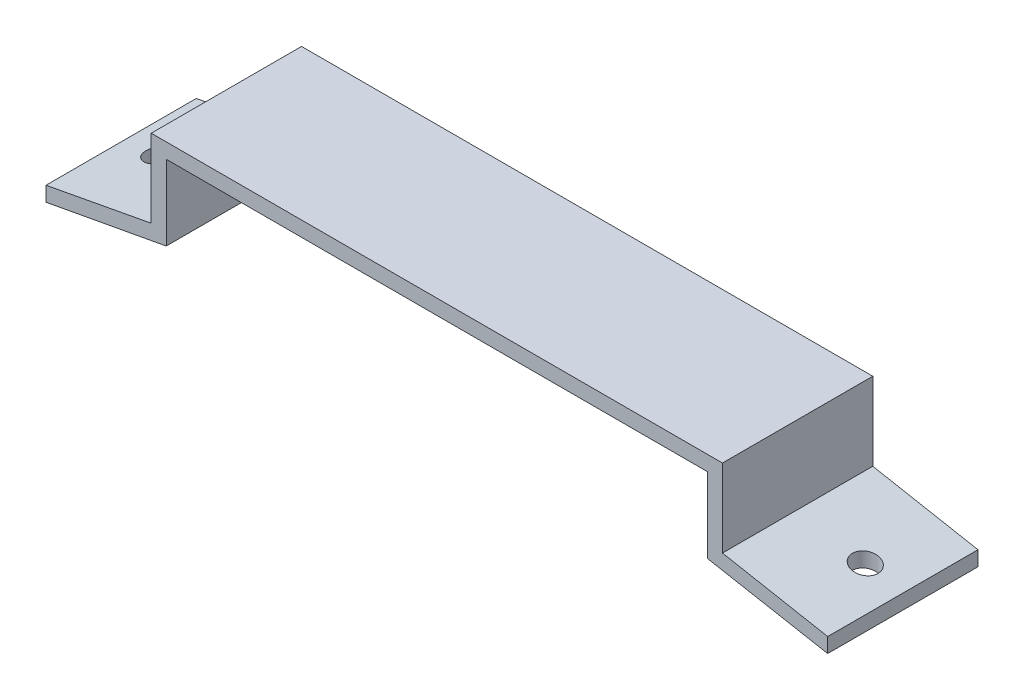
ISO-10303-21;
HEADER;
FILE_DESCRIPTION(('STEP AP214'),'2;1');
FILE_NAME('part.step','',(''),(''),'','','');
FILE_SCHEMA(('AUTOMOTIVE_DESIGN { 1 0 10303 214 1 1 1 1 }'));
ENDSEC;
DATA;
#1=APPLICATION_CONTEXT('core data for automotive mechanical design processes');
#2=APPLICATION_PROTOCOL_DEFINITION('international standard','automotive_design',2000,#1);
#3=PRODUCT_CONTEXT('',#1,'mechanical');
#4=PRODUCT('Part','Part','',(#3));
#5=PRODUCT_RELATED_PRODUCT_CATEGORY('part','',(#4));
#6=PRODUCT_DEFINITION_FORMATION('','',#4);
#7=PRODUCT_DEFINITION_CONTEXT('part definition',#1,'design');
#8=PRODUCT_DEFINITION('design','',#6,#7);
#9=PRODUCT_DEFINITION_SHAPE('','',#8);
#10=(LENGTH_UNIT() NAMED_UNIT(*) SI_UNIT(.MILLI.,.METRE.));
#11=(NAMED_UNIT(*) PLANE_ANGLE_UNIT() SI_UNIT($,.RADIAN.));
#12=(NAMED_UNIT(*) SI_UNIT($,.STERADIAN.) SOLID_ANGLE_UNIT());
#13=UNCERTAINTY_MEASURE_WITH_UNIT(LENGTH_MEASURE(1.E-05),#10,'distance_accuracy_value','');
#14=(GEOMETRIC_REPRESENTATION_CONTEXT(3) GLOBAL_UNCERTAINTY_ASSIGNED_CONTEXT((#13)) GLOBAL_UNIT_ASSIGNED_CONTEXT((#10,
#11,#12)) REPRESENTATION_CONTEXT('',''));
#15=CARTESIAN_POINT('',(0.,0.,0.));
#16=DIRECTION('',(0.,0.,1.));
#17=DIRECTION('',(1.,0.,0.));
#18=AXIS2_PLACEMENT_3D('',#15,#16,#17);
#19=CARTESIAN_POINT('',(0.,0.,10.));
#20=DIRECTION('',(0.,0.,1.));
#21=DIRECTION('',(1.,0.,0.));
#22=AXIS2_PLACEMENT_3D('',#19,#20,#21);
#23=PLANE('',#22);
#24=DIRECTION('',(0.983332166035633,0.181818181818182,0.));
#25=VECTOR('',#24,1.);
#26=CARTESIAN_POINT('',(-36.,0.,10.));
#27=LINE('',#26,#25);
#28=CARTESIAN_POINT('',(-52.,-2.95840104653455,10.));
#29=VERTEX_POINT('',#28);
#30=CARTESIAN_POINT('',(-36.,0.,10.));
#31=VERTEX_POINT('',#30);
#32=EDGE_CURVE('E214',#29,#31,#27,.T.);
#33=ORIENTED_EDGE('',*,*,#32,.T.);
#34=DIRECTION('',(0.,-1.,0.));
#35=VECTOR('',#34,1.);
#36=CARTESIAN_POINT('',(-36.,10.,10.));
#37=LINE('',#36,#35);
#38=CARTESIAN_POINT('',(-36.,10.,10.));
#39=VERTEX_POINT('',#38);
#40=EDGE_CURVE('E192',#39,#31,#37,.T.);
#41=ORIENTED_EDGE('',*,*,#40,.F.);
#42=DIRECTION('',(1.,0.,0.));
#43=VECTOR('',#42,1.);
#44=CARTESIAN_POINT('',(0.,10.,10.));
#45=LINE('',#44,#43);
#46=CARTESIAN_POINT('',(36.,10.,10.));
#47=VERTEX_POINT('',#46);
#48=EDGE_CURVE('E190',#39,#47,#45,.T.);
#49=ORIENTED_EDGE('',*,*,#48,.T.);
#50=DIRECTION('',(0.,-1.,0.));
#51=VECTOR('',#50,1.);
#52=CARTESIAN_POINT('',(36.,10.,10.));
#53=LINE('',#52,#51);
#54=CARTESIAN_POINT('',(36.,0.,10.));
#55=VERTEX_POINT('',#54);
#56=EDGE_CURVE('E141',#47,#55,#53,.T.);
#57=ORIENTED_EDGE('',*,*,#56,.T.);
#58=DIRECTION('',(-0.983332166035633,0.181818181818182,0.));
#59=VECTOR('',#58,1.);
#60=CARTESIAN_POINT('',(36.,0.,10.));
#61=LINE('',#60,#59);
#62=CARTESIAN_POINT('',(52.,-2.95840104653455,10.));
#63=VERTEX_POINT('',#62);
#64=EDGE_CURVE('E170',#63,#55,#61,.T.);
#65=ORIENTED_EDGE('',*,*,#64,.F.);
#66=DIRECTION('',(0.,-1.,0.));
#67=VECTOR('',#66,1.);
#68=CARTESIAN_POINT('',(52.,-0.992722896260925,10.));
#69=LINE('',#68,#67);
#70=CARTESIAN_POINT('',(52.,-0.992722896260925,10.));
#71=VERTEX_POINT('',#70);
#72=EDGE_CURVE('E167',#71,#63,#69,.T.);
#73=ORIENTED_EDGE('',*,*,#72,.F.);
#74=DIRECTION('',(0.982953069989005,-0.183856634906629,0.));
#75=VECTOR('',#74,1.);
#76=CARTESIAN_POINT('',(36.,2.,10.));
#77=LINE('',#76,#75);
#78=CARTESIAN_POINT('',(38.,1.62590963796738,10.));
#79=VERTEX_POINT('',#78);
#80=EDGE_CURVE('E164',#79,#71,#77,.T.);
#81=ORIENTED_EDGE('',*,*,#80,.F.);
#82=DIRECTION('',(0.,-1.,0.));
#83=VECTOR('',#82,1.);
#84=CARTESIAN_POINT('',(38.,12.,10.));
#85=LINE('',#84,#83);
#86=CARTESIAN_POINT('',(38.,12.,10.));
#87=VERTEX_POINT('',#86);
#88=EDGE_CURVE('E152',#87,#79,#85,.T.);
#89=ORIENTED_EDGE('',*,*,#88,.F.);
#90=DIRECTION('',(1.,0.,0.));
#91=VECTOR('',#90,1.);
#92=CARTESIAN_POINT('',(0.,12.,10.));
#93=LINE('',#92,#91);
#94=CARTESIAN_POINT('',(-38.,12.,10.));
#95=VERTEX_POINT('',#94);
#96=EDGE_CURVE('E200',#95,#87,#93,.T.);
#97=ORIENTED_EDGE('',*,*,#96,.F.);
#98=DIRECTION('',(0.,-1.,0.));
#99=VECTOR('',#98,1.);
#100=CARTESIAN_POINT('',(-38.,12.,10.));
#101=LINE('',#100,#99);
#102=CARTESIAN_POINT('',(-38.,1.62590963796738,10.));
#103=VERTEX_POINT('',#102);
#104=EDGE_CURVE('E202',#95,#103,#101,.T.);
#105=ORIENTED_EDGE('',*,*,#104,.T.);
#106=DIRECTION('',(-0.982953069989005,-0.183856634906629,0.));
#107=VECTOR('',#106,1.);
#108=CARTESIAN_POINT('',(-36.,2.,10.));
#109=LINE('',#108,#107);
#110=CARTESIAN_POINT('',(-52.,-0.992722896260925,10.));
#111=VERTEX_POINT('',#110);
#112=EDGE_CURVE('E51',#103,#111,#109,.T.);
#113=ORIENTED_EDGE('',*,*,#112,.T.);
#114=DIRECTION('',(0.,-1.,0.));
#115=VECTOR('',#114,1.);
#116=CARTESIAN_POINT('',(-52.,-0.992722896260925,10.));
#117=LINE('',#116,#115);
#118=EDGE_CURVE('E211',#111,#29,#117,.T.);
#119=ORIENTED_EDGE('',*,*,#118,.T.);
#120=EDGE_LOOP('',(#33,#41,#49,#57,#65,#73,#81,#89,#97,#105,#113,#119));
#121=FACE_BOUND('',#120,.T.);
#122=ADVANCED_FACE('F35',(#121),#23,.T.);
#123=CARTESIAN_POINT('',(0.,0.,-10.));
#124=DIRECTION('',(0.,0.,1.));
#125=DIRECTION('',(1.,0.,0.));
#126=AXIS2_PLACEMENT_3D('',#123,#124,#125);
#127=PLANE('',#126);
#128=DIRECTION('',(0.,-1.,0.));
#129=VECTOR('',#128,1.);
#130=CARTESIAN_POINT('',(-36.,10.,-10.));
#131=LINE('',#130,#129);
#132=CARTESIAN_POINT('',(-36.,10.,-10.));
#133=VERTEX_POINT('',#132);
#134=CARTESIAN_POINT('',(-36.,0.,-10.));
#135=VERTEX_POINT('',#134);
#136=EDGE_CURVE('E194',#133,#135,#131,.T.);
#137=ORIENTED_EDGE('',*,*,#136,.T.);
#138=DIRECTION('',(0.983332166035633,0.181818181818182,0.));
#139=VECTOR('',#138,1.);
#140=CARTESIAN_POINT('',(-36.,0.,-10.));
#141=LINE('',#140,#139);
#142=CARTESIAN_POINT('',(-52.,-2.95840104653455,-10.));
#143=VERTEX_POINT('',#142);
#144=EDGE_CURVE('E212',#143,#135,#141,.T.);
#145=ORIENTED_EDGE('',*,*,#144,.F.);
#146=DIRECTION('',(0.,-1.,0.));
#147=VECTOR('',#146,1.);
#148=CARTESIAN_POINT('',(-52.,-0.992722896260925,-10.));
#149=LINE('',#148,#147);
#150=CARTESIAN_POINT('',(-52.,-0.992722896260925,-10.));
#151=VERTEX_POINT('',#150);
#152=EDGE_CURVE('E219',#151,#143,#149,.T.);
#153=ORIENTED_EDGE('',*,*,#152,.F.);
#154=DIRECTION('',(-0.982953069989005,-0.183856634906629,0.));
#155=VECTOR('',#154,1.);
#156=CARTESIAN_POINT('',(-36.,2.,-10.));
#157=LINE('',#156,#155);
#158=CARTESIAN_POINT('',(-38.,1.62590963796738,-10.));
#159=VERTEX_POINT('',#158);
#160=EDGE_CURVE('E209',#159,#151,#157,.T.);
#161=ORIENTED_EDGE('',*,*,#160,.F.);
#162=DIRECTION('',(0.,-1.,0.));
#163=VECTOR('',#162,1.);
#164=CARTESIAN_POINT('',(-38.,12.,-10.));
#165=LINE('',#164,#163);
#166=CARTESIAN_POINT('',(-38.,12.,-10.));
#167=VERTEX_POINT('',#166);
#168=EDGE_CURVE('E205',#167,#159,#165,.T.);
#169=ORIENTED_EDGE('',*,*,#168,.F.);
#170=DIRECTION('',(1.,0.,0.));
#171=VECTOR('',#170,1.);
#172=CARTESIAN_POINT('',(0.,12.,-10.));
#173=LINE('',#172,#171);
#174=CARTESIAN_POINT('',(38.,12.,-10.));
#175=VERTEX_POINT('',#174);
#176=EDGE_CURVE('E196',#167,#175,#173,.T.);
#177=ORIENTED_EDGE('',*,*,#176,.T.);
#178=DIRECTION('',(0.,-1.,0.));
#179=VECTOR('',#178,1.);
#180=CARTESIAN_POINT('',(38.,12.,-10.));
#181=LINE('',#180,#179);
#182=CARTESIAN_POINT('',(38.,1.62590963796738,-10.));
#183=VERTEX_POINT('',#182);
#184=EDGE_CURVE('E158',#175,#183,#181,.T.);
#185=ORIENTED_EDGE('',*,*,#184,.T.);
#186=DIRECTION('',(0.982953069989005,-0.183856634906629,0.));
#187=VECTOR('',#186,1.);
#188=CARTESIAN_POINT('',(36.,2.,-10.));
#189=LINE('',#188,#187);
#190=CARTESIAN_POINT('',(52.,-0.992722896260925,-10.));
#191=VERTEX_POINT('',#190);
#192=EDGE_CURVE('E163',#183,#191,#189,.T.);
#193=ORIENTED_EDGE('',*,*,#192,.T.);
#194=DIRECTION('',(0.,-1.,0.));
#195=VECTOR('',#194,1.);
#196=CARTESIAN_POINT('',(52.,-0.992722896260925,-10.));
#197=LINE('',#196,#195);
#198=CARTESIAN_POINT('',(52.,-2.95840104653455,-10.));
#199=VERTEX_POINT('',#198);
#200=EDGE_CURVE('E176',#191,#199,#197,.T.);
#201=ORIENTED_EDGE('',*,*,#200,.T.);
#202=DIRECTION('',(-0.983332166035633,0.181818181818182,0.));
#203=VECTOR('',#202,1.);
#204=CARTESIAN_POINT('',(36.,0.,-10.));
#205=LINE('',#204,#203);
#206=CARTESIAN_POINT('',(36.,0.,-10.));
#207=VERTEX_POINT('',#206);
#208=EDGE_CURVE('E148',#199,#207,#205,.T.);
#209=ORIENTED_EDGE('',*,*,#208,.T.);
#210=DIRECTION('',(0.,-1.,0.));
#211=VECTOR('',#210,1.);
#212=CARTESIAN_POINT('',(36.,10.,-10.));
#213=LINE('',#212,#211);
#214=CARTESIAN_POINT('',(36.,10.,-10.));
#215=VERTEX_POINT('',#214);
#216=EDGE_CURVE('E139',#215,#207,#213,.T.);
#217=ORIENTED_EDGE('',*,*,#216,.F.);
#218=DIRECTION('',(1.,0.,0.));
#219=VECTOR('',#218,1.);
#220=CARTESIAN_POINT('',(0.,10.,-10.));
#221=LINE('',#220,#219);
#222=EDGE_CURVE('E124',#133,#215,#221,.T.);
#223=ORIENTED_EDGE('',*,*,#222,.F.);
#224=EDGE_LOOP('',(#137,#145,#153,#161,#169,#177,#185,#193,#201,#209,#217,#223));
#225=FACE_BOUND('',#224,.T.);
#226=ADVANCED_FACE('F145',(#225),#127,.F.);
#227=CARTESIAN_POINT('',(-36.,2.,10.));
#228=DIRECTION('',(0.183856634906629,-0.982953069989005,0.));
#229=DIRECTION('',(0.982953069989006,0.183856634906629,0.));
#230=AXIS2_PLACEMENT_3D('',#227,#228,#229);
#231=PLANE('',#230);
#232=CARTESIAN_POINT('',(-47.,-0.057496991179387,0.));
#233=DIRECTION('',(0.183856634906629,-0.982953069989005,0.));
#234=DIRECTION('',(0.982953069989006,0.183856634906629,0.));
#235=AXIS2_PLACEMENT_3D('',#232,#233,#234);
#236=ELLIPSE('',#235,1.72948236482848,1.7);
#237=CARTESIAN_POINT('',(-45.3,0.260479816548336,0.));
#238=VERTEX_POINT('',#237);
#239=EDGE_CURVE('E134',#238,#238,#236,.T.);
#240=ORIENTED_EDGE('',*,*,#239,.T.);
#241=EDGE_LOOP('',(#240));
#242=FACE_BOUND('',#241,.T.);
#243=DIRECTION('',(0.,0.,1.));
#244=VECTOR('',#243,1.);
#245=CARTESIAN_POINT('',(-38.,1.62590963796738,10.));
#246=LINE('',#245,#244);
#247=EDGE_CURVE('E55',#159,#103,#246,.T.);
#248=ORIENTED_EDGE('',*,*,#247,.F.);
#249=ORIENTED_EDGE('',*,*,#160,.T.);
#250=DIRECTION('',(0.,0.,-1.));
#251=VECTOR('',#250,1.);
#252=CARTESIAN_POINT('',(-52.,-0.992722896260925,10.));
#253=LINE('',#252,#251);
#254=EDGE_CURVE('E11',#111,#151,#253,.T.);
#255=ORIENTED_EDGE('',*,*,#254,.F.);
#256=ORIENTED_EDGE('',*,*,#112,.F.);
#257=EDGE_LOOP('',(#248,#249,#255,#256));
#258=FACE_BOUND('',#257,.T.);
#259=ADVANCED_FACE('F37',(#242,#258),#231,.F.);
#260=CARTESIAN_POINT('',(-52.,-0.992722896260925,10.));
#261=DIRECTION('',(1.,0.,0.));
#262=DIRECTION('',(0.,0.,-1.));
#263=AXIS2_PLACEMENT_3D('',#260,#261,#262);
#264=PLANE('',#263);
#265=ORIENTED_EDGE('',*,*,#152,.T.);
#266=DIRECTION('',(0.,0.,-1.));
#267=VECTOR('',#266,1.);
#268=CARTESIAN_POINT('',(-52.,-2.95840104653455,10.));
#269=LINE('',#268,#267);
#270=EDGE_CURVE('E44',#29,#143,#269,.T.);
#271=ORIENTED_EDGE('',*,*,#270,.F.);
#272=ORIENTED_EDGE('',*,*,#118,.F.);
#273=ORIENTED_EDGE('',*,*,#254,.T.);
#274=EDGE_LOOP('',(#265,#271,#272,#273));
#275=FACE_BOUND('',#274,.T.);
#276=ADVANCED_FACE('F238',(#275),#264,.F.);
#277=CARTESIAN_POINT('',(-36.,0.,10.));
#278=DIRECTION('',(-0.181818181818182,0.983332166035633,0.));
#279=DIRECTION('',(-0.983332166035634,-0.181818181818182,0.));
#280=AXIS2_PLACEMENT_3D('',#277,#278,#279);
#281=PLANE('',#280);
#282=CARTESIAN_POINT('',(-47.,-2.03390071949251,0.));
#283=DIRECTION('',(-0.181818181818182,0.983332166035633,0.));
#284=DIRECTION('',(0.983332166035634,0.181818181818182,0.));
#285=AXIS2_PLACEMENT_3D('',#282,#283,#284);
#286=ELLIPSE('',#285,1.72881561156863,1.7);
#287=CARTESIAN_POINT('',(-45.3,-1.71957060829821,0.));
#288=VERTEX_POINT('',#287);
#289=EDGE_CURVE('E39',#288,#288,#286,.T.);
#290=ORIENTED_EDGE('',*,*,#289,.T.);
#291=EDGE_LOOP('',(#290));
#292=FACE_BOUND('',#291,.T.);
#293=ORIENTED_EDGE('',*,*,#144,.T.);
#294=DIRECTION('',(0.,0.,-1.));
#295=VECTOR('',#294,1.);
#296=CARTESIAN_POINT('',(-36.,0.,10.));
#297=LINE('',#296,#295);
#298=EDGE_CURVE('E217',#31,#135,#297,.T.);
#299=ORIENTED_EDGE('',*,*,#298,.F.);
#300=ORIENTED_EDGE('',*,*,#32,.F.);
#301=ORIENTED_EDGE('',*,*,#270,.T.);
#302=EDGE_LOOP('',(#293,#299,#300,#301));
#303=FACE_BOUND('',#302,.T.);
#304=ADVANCED_FACE('F229',(#292,#303),#281,.F.);
#305=CARTESIAN_POINT('',(-38.,12.,0.));
#306=DIRECTION('',(1.,0.,0.));
#307=DIRECTION('',(0.,0.,-1.));
#308=AXIS2_PLACEMENT_3D('',#305,#306,#307);
#309=PLANE('',#308);
#310=ORIENTED_EDGE('',*,*,#168,.T.);
#311=ORIENTED_EDGE('',*,*,#247,.T.);
#312=ORIENTED_EDGE('',*,*,#104,.F.);
#313=DIRECTION('',(0.,0.,1.));
#314=VECTOR('',#313,1.);
#315=CARTESIAN_POINT('',(-38.,12.,0.));
#316=LINE('',#315,#314);
#317=EDGE_CURVE('E198',#167,#95,#316,.T.);
#318=ORIENTED_EDGE('',*,*,#317,.F.);
#319=EDGE_LOOP('',(#310,#311,#312,#318));
#320=FACE_BOUND('',#319,.T.);
#321=ADVANCED_FACE('F241',(#320),#309,.F.);
#322=CARTESIAN_POINT('',(0.,12.,0.));
#323=DIRECTION('',(0.,1.,0.));
#324=DIRECTION('',(0.,0.,1.));
#325=AXIS2_PLACEMENT_3D('',#322,#323,#324);
#326=PLANE('',#325);
#327=ORIENTED_EDGE('',*,*,#176,.F.);
#328=ORIENTED_EDGE('',*,*,#317,.T.);
#329=ORIENTED_EDGE('',*,*,#96,.T.);
#330=DIRECTION('',(0.,0.,1.));
#331=VECTOR('',#330,1.);
#332=CARTESIAN_POINT('',(38.,12.,0.));
#333=LINE('',#332,#331);
#334=EDGE_CURVE('E149',#175,#87,#333,.T.);
#335=ORIENTED_EDGE('',*,*,#334,.F.);
#336=EDGE_LOOP('',(#327,#328,#329,#335));
#337=FACE_BOUND('',#336,.T.);
#338=ADVANCED_FACE('F247',(#337),#326,.T.);
#339=CARTESIAN_POINT('',(-36.,10.,0.));
#340=DIRECTION('',(1.,0.,0.));
#341=DIRECTION('',(0.,0.,-1.));
#342=AXIS2_PLACEMENT_3D('',#339,#340,#341);
#343=PLANE('',#342);
#344=ORIENTED_EDGE('',*,*,#298,.T.);
#345=ORIENTED_EDGE('',*,*,#136,.F.);
#346=DIRECTION('',(0.,0.,1.));
#347=VECTOR('',#346,1.);
#348=CARTESIAN_POINT('',(-36.,10.,0.));
#349=LINE('',#348,#347);
#350=EDGE_CURVE('E130',#133,#39,#349,.T.);
#351=ORIENTED_EDGE('',*,*,#350,.T.);
#352=ORIENTED_EDGE('',*,*,#40,.T.);
#353=EDGE_LOOP('',(#344,#345,#351,#352));
#354=FACE_BOUND('',#353,.T.);
#355=ADVANCED_FACE('F235',(#354),#343,.T.);
#356=CARTESIAN_POINT('',(0.,10.,0.));
#357=DIRECTION('',(0.,1.,0.));
#358=DIRECTION('',(0.,0.,1.));
#359=AXIS2_PLACEMENT_3D('',#356,#357,#358);
#360=PLANE('',#359);
#361=ORIENTED_EDGE('',*,*,#222,.T.);
#362=DIRECTION('',(0.,0.,1.));
#363=VECTOR('',#362,1.);
#364=CARTESIAN_POINT('',(36.,10.,0.));
#365=LINE('',#364,#363);
#366=EDGE_CURVE('E128',#215,#47,#365,.T.);
#367=ORIENTED_EDGE('',*,*,#366,.T.);
#368=ORIENTED_EDGE('',*,*,#48,.F.);
#369=ORIENTED_EDGE('',*,*,#350,.F.);
#370=EDGE_LOOP('',(#361,#367,#368,#369));
#371=FACE_BOUND('',#370,.T.);
#372=ADVANCED_FACE('F126',(#371),#360,.F.);
#373=CARTESIAN_POINT('',(-47.,-2.95840104653455,0.));
#374=DIRECTION('',(0.,1.,0.));
#375=DIRECTION('',(0.,0.,1.));
#376=AXIS2_PLACEMENT_3D('',#373,#374,#375);
#377=CYLINDRICAL_SURFACE('',#376,1.7);
#378=ORIENTED_EDGE('',*,*,#289,.F.);
#379=EDGE_LOOP('',(#378));
#380=FACE_BOUND('',#379,.T.);
#381=ORIENTED_EDGE('',*,*,#239,.F.);
#382=EDGE_LOOP('',(#381));
#383=FACE_BOUND('',#382,.T.);
#384=ADVANCED_FACE('F293',(#380,#383),#377,.F.);
#385=CARTESIAN_POINT('',(36.,2.,10.));
#386=DIRECTION('',(-0.183856634906629,-0.982953069989005,0.));
#387=DIRECTION('',(-0.982953069989006,0.183856634906629,0.));
#388=AXIS2_PLACEMENT_3D('',#385,#386,#387);
#389=PLANE('',#388);
#390=CARTESIAN_POINT('',(47.,-0.057496991179387,0.));
#391=DIRECTION('',(0.183856634906629,0.982953069989005,0.));
#392=DIRECTION('',(-0.982953069989006,0.183856634906629,0.));
#393=AXIS2_PLACEMENT_3D('',#390,#391,#392);
#394=ELLIPSE('',#393,1.72948236482848,1.7);
#395=CARTESIAN_POINT('',(45.3,0.260479816548336,0.));
#396=VERTEX_POINT('',#395);
#397=EDGE_CURVE('E142',#396,#396,#394,.T.);
#398=ORIENTED_EDGE('',*,*,#397,.F.);
#399=EDGE_LOOP('',(#398));
#400=FACE_BOUND('',#399,.T.);
#401=DIRECTION('',(0.,0.,1.));
#402=VECTOR('',#401,1.);
#403=CARTESIAN_POINT('',(38.,1.62590963796738,10.));
#404=LINE('',#403,#402);
#405=EDGE_CURVE('E161',#183,#79,#404,.T.);
#406=ORIENTED_EDGE('',*,*,#405,.T.);
#407=ORIENTED_EDGE('',*,*,#80,.T.);
#408=DIRECTION('',(0.,0.,-1.));
#409=VECTOR('',#408,1.);
#410=CARTESIAN_POINT('',(52.,-0.992722896260925,10.));
#411=LINE('',#410,#409);
#412=EDGE_CURVE('E182',#71,#191,#411,.T.);
#413=ORIENTED_EDGE('',*,*,#412,.T.);
#414=ORIENTED_EDGE('',*,*,#192,.F.);
#415=EDGE_LOOP('',(#406,#407,#413,#414));
#416=FACE_BOUND('',#415,.T.);
#417=ADVANCED_FACE('F255',(#400,#416),#389,.F.);
#418=CARTESIAN_POINT('',(52.,-0.992722896260925,10.));
#419=DIRECTION('',(-1.,0.,0.));
#420=DIRECTION('',(0.,0.,-1.));
#421=AXIS2_PLACEMENT_3D('',#418,#419,#420);
#422=PLANE('',#421);
#423=ORIENTED_EDGE('',*,*,#200,.F.);
#424=ORIENTED_EDGE('',*,*,#412,.F.);
#425=ORIENTED_EDGE('',*,*,#72,.T.);
#426=DIRECTION('',(0.,0.,-1.));
#427=VECTOR('',#426,1.);
#428=CARTESIAN_POINT('',(52.,-2.95840104653455,10.));
#429=LINE('',#428,#427);
#430=EDGE_CURVE('E180',#63,#199,#429,.T.);
#431=ORIENTED_EDGE('',*,*,#430,.T.);
#432=EDGE_LOOP('',(#423,#424,#425,#431));
#433=FACE_BOUND('',#432,.T.);
#434=ADVANCED_FACE('F259',(#433),#422,.F.);
#435=CARTESIAN_POINT('',(36.,0.,10.));
#436=DIRECTION('',(0.181818181818182,0.983332166035633,0.));
#437=DIRECTION('',(0.983332166035634,-0.181818181818182,0.));
#438=AXIS2_PLACEMENT_3D('',#435,#436,#437);
#439=PLANE('',#438);
#440=CARTESIAN_POINT('',(47.,-2.03390071949251,0.));
#441=DIRECTION('',(-0.181818181818182,-0.983332166035633,0.));
#442=DIRECTION('',(-0.983332166035634,0.181818181818182,0.));
#443=AXIS2_PLACEMENT_3D('',#440,#441,#442);
#444=ELLIPSE('',#443,1.72881561156863,1.7);
#445=CARTESIAN_POINT('',(45.3,-1.71957060829821,0.));
#446=VERTEX_POINT('',#445);
#447=EDGE_CURVE('E184',#446,#446,#444,.T.);
#448=ORIENTED_EDGE('',*,*,#447,.F.);
#449=EDGE_LOOP('',(#448));
#450=FACE_BOUND('',#449,.T.);
#451=ORIENTED_EDGE('',*,*,#208,.F.);
#452=ORIENTED_EDGE('',*,*,#430,.F.);
#453=ORIENTED_EDGE('',*,*,#64,.T.);
#454=DIRECTION('',(0.,0.,-1.));
#455=VECTOR('',#454,1.);
#456=CARTESIAN_POINT('',(36.,0.,10.));
#457=LINE('',#456,#455);
#458=EDGE_CURVE('E173',#55,#207,#457,.T.);
#459=ORIENTED_EDGE('',*,*,#458,.T.);
#460=EDGE_LOOP('',(#451,#452,#453,#459));
#461=FACE_BOUND('',#460,.T.);
#462=ADVANCED_FACE('F262',(#450,#461),#439,.F.);
#463=CARTESIAN_POINT('',(38.,12.,0.));
#464=DIRECTION('',(-1.,0.,0.));
#465=DIRECTION('',(0.,0.,-1.));
#466=AXIS2_PLACEMENT_3D('',#463,#464,#465);
#467=PLANE('',#466);
#468=ORIENTED_EDGE('',*,*,#184,.F.);
#469=ORIENTED_EDGE('',*,*,#334,.T.);
#470=ORIENTED_EDGE('',*,*,#88,.T.);
#471=ORIENTED_EDGE('',*,*,#405,.F.);
#472=EDGE_LOOP('',(#468,#469,#470,#471));
#473=FACE_BOUND('',#472,.T.);
#474=ADVANCED_FACE('F251',(#473),#467,.F.);
#475=CARTESIAN_POINT('',(36.,10.,0.));
#476=DIRECTION('',(-1.,0.,0.));
#477=DIRECTION('',(0.,0.,-1.));
#478=AXIS2_PLACEMENT_3D('',#475,#476,#477);
#479=PLANE('',#478);
#480=ORIENTED_EDGE('',*,*,#458,.F.);
#481=ORIENTED_EDGE('',*,*,#56,.F.);
#482=ORIENTED_EDGE('',*,*,#366,.F.);
#483=ORIENTED_EDGE('',*,*,#216,.T.);
#484=EDGE_LOOP('',(#480,#481,#482,#483));
#485=FACE_BOUND('',#484,.T.);
#486=ADVANCED_FACE('F138',(#485),#479,.T.);
#487=CARTESIAN_POINT('',(47.,-2.95840104653455,0.));
#488=DIRECTION('',(0.,1.,0.));
#489=DIRECTION('',(0.,0.,1.));
#490=AXIS2_PLACEMENT_3D('',#487,#488,#489);
#491=CYLINDRICAL_SURFACE('',#490,1.7);
#492=ORIENTED_EDGE('',*,*,#447,.T.);
#493=EDGE_LOOP('',(#492));
#494=FACE_BOUND('',#493,.T.);
#495=ORIENTED_EDGE('',*,*,#397,.T.);
#496=EDGE_LOOP('',(#495));
#497=FACE_BOUND('',#496,.T.);
#498=ADVANCED_FACE('F380',(#494,#497),#491,.F.);
#499=CLOSED_SHELL('',(#122,#226,#259,#276,#304,#321,#338,#355,#372,#384,#417,#434,#462,#474,
#486,#498));
#500=MANIFOLD_SOLID_BREP('B2',#499);
#501=ADVANCED_BREP_SHAPE_REPRESENTATION('',(#18,#500),#14);
#502=SHAPE_DEFINITION_REPRESENTATION(#9,#501);
ENDSEC;
END-ISO-10303-21;
